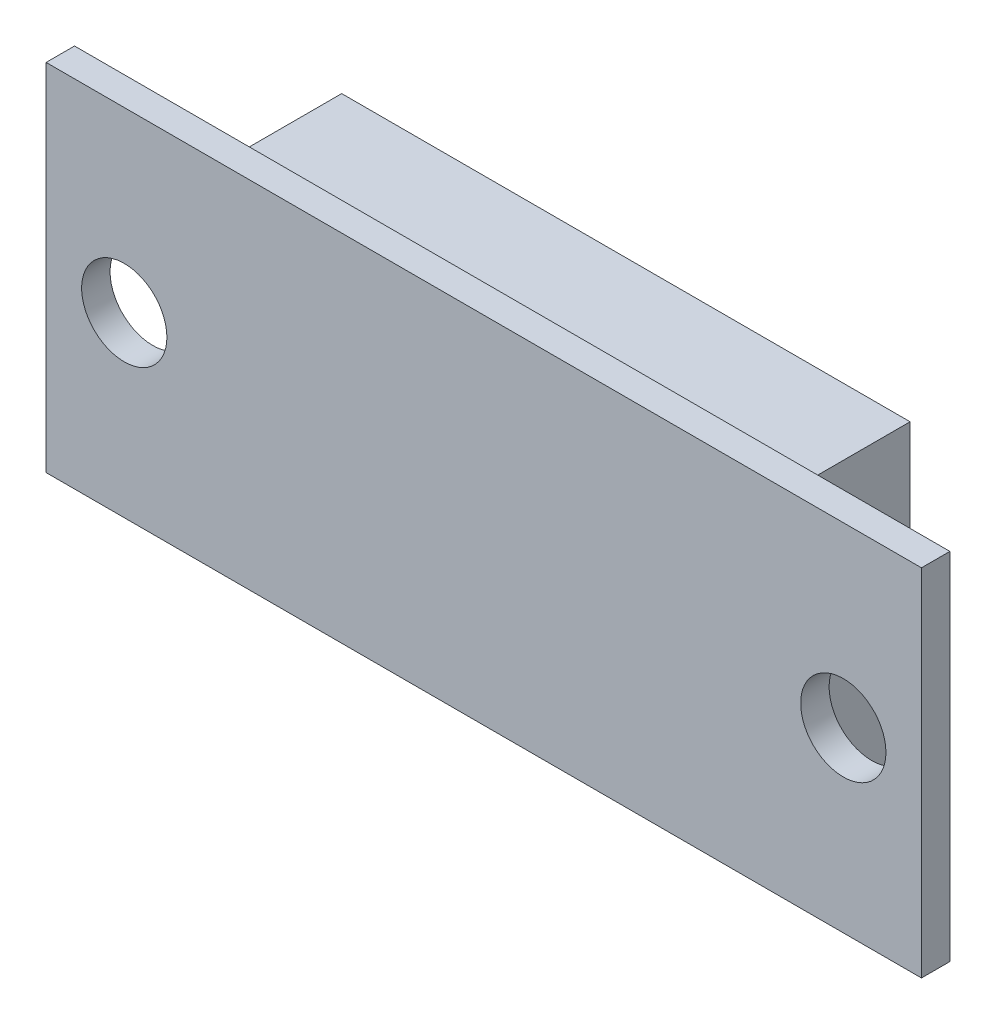
ISO-10303-21;
HEADER;
FILE_DESCRIPTION(('STEP AP214'),'2;1');
FILE_NAME('part.step','',(''),(''),'','','');
FILE_SCHEMA(('AUTOMOTIVE_DESIGN { 1 0 10303 214 1 1 1 1 }'));
ENDSEC;
DATA;
#1=APPLICATION_CONTEXT('core data for automotive mechanical design processes');
#2=APPLICATION_PROTOCOL_DEFINITION('international standard','automotive_design',2000,#1);
#3=PRODUCT_CONTEXT('',#1,'mechanical');
#4=PRODUCT('Part','Part','',(#3));
#5=PRODUCT_RELATED_PRODUCT_CATEGORY('part','',(#4));
#6=PRODUCT_DEFINITION_FORMATION('','',#4);
#7=PRODUCT_DEFINITION_CONTEXT('part definition',#1,'design');
#8=PRODUCT_DEFINITION('design','',#6,#7);
#9=PRODUCT_DEFINITION_SHAPE('','',#8);
#10=(LENGTH_UNIT() NAMED_UNIT(*) SI_UNIT(.MILLI.,.METRE.));
#11=(NAMED_UNIT(*) PLANE_ANGLE_UNIT() SI_UNIT($,.RADIAN.));
#12=(NAMED_UNIT(*) SI_UNIT($,.STERADIAN.) SOLID_ANGLE_UNIT());
#13=UNCERTAINTY_MEASURE_WITH_UNIT(LENGTH_MEASURE(1.E-05),#10,'distance_accuracy_value','');
#14=(GEOMETRIC_REPRESENTATION_CONTEXT(3) GLOBAL_UNCERTAINTY_ASSIGNED_CONTEXT((#13)) GLOBAL_UNIT_ASSIGNED_CONTEXT((#10,
#11,#12)) REPRESENTATION_CONTEXT('',''));
#15=CARTESIAN_POINT('',(0.,0.,0.));
#16=DIRECTION('',(0.,0.,1.));
#17=DIRECTION('',(1.,0.,0.));
#18=AXIS2_PLACEMENT_3D('',#15,#16,#17);
#19=CARTESIAN_POINT('',(15.4,6.25,5.));
#20=DIRECTION('',(0.,0.,-1.));
#21=DIRECTION('',(-1.,0.,0.));
#22=AXIS2_PLACEMENT_3D('',#19,#20,#21);
#23=PLANE('',#22);
#24=DIRECTION('',(0.,1.,0.));
#25=VECTOR('',#24,1.);
#26=CARTESIAN_POINT('',(15.4,-6.25,5.));
#27=LINE('',#26,#25);
#28=CARTESIAN_POINT('',(15.4,-6.25,5.));
#29=VERTEX_POINT('',#28);
#30=CARTESIAN_POINT('',(15.4,6.25,5.));
#31=VERTEX_POINT('',#30);
#32=EDGE_CURVE('E118',#29,#31,#27,.T.);
#33=ORIENTED_EDGE('',*,*,#32,.T.);
#34=DIRECTION('',(-1.,0.,0.));
#35=VECTOR('',#34,1.);
#36=CARTESIAN_POINT('',(-15.4,6.25,5.));
#37=LINE('',#36,#35);
#38=CARTESIAN_POINT('',(-15.4,6.25,5.));
#39=VERTEX_POINT('',#38);
#40=EDGE_CURVE('E107',#31,#39,#37,.T.);
#41=ORIENTED_EDGE('',*,*,#40,.T.);
#42=DIRECTION('',(0.,-1.,0.));
#43=VECTOR('',#42,1.);
#44=CARTESIAN_POINT('',(-15.4,-6.25,5.));
#45=LINE('',#44,#43);
#46=CARTESIAN_POINT('',(-15.4,-6.25,5.));
#47=VERTEX_POINT('',#46);
#48=EDGE_CURVE('E117',#39,#47,#45,.T.);
#49=ORIENTED_EDGE('',*,*,#48,.T.);
#50=DIRECTION('',(1.,0.,0.));
#51=VECTOR('',#50,1.);
#52=CARTESIAN_POINT('',(-15.4,-6.25,5.));
#53=LINE('',#52,#51);
#54=EDGE_CURVE('E123',#47,#29,#53,.T.);
#55=ORIENTED_EDGE('',*,*,#54,.T.);
#56=EDGE_LOOP('',(#33,#41,#49,#55));
#57=FACE_BOUND('',#56,.T.);
#58=CARTESIAN_POINT('',(12.65,0.,5.));
#59=DIRECTION('',(0.,0.,1.));
#60=DIRECTION('',(1.,0.,0.));
#61=AXIS2_PLACEMENT_3D('',#58,#59,#60);
#62=CIRCLE('',#61,1.49999999999999);
#63=CARTESIAN_POINT('',(14.15,0.,5.));
#64=VERTEX_POINT('',#63);
#65=EDGE_CURVE('E199',#64,#64,#62,.T.);
#66=ORIENTED_EDGE('',*,*,#65,.F.);
#67=EDGE_LOOP('',(#66));
#68=FACE_BOUND('',#67,.T.);
#69=CARTESIAN_POINT('',(-12.65,0.,5.));
#70=DIRECTION('',(0.,0.,1.));
#71=DIRECTION('',(1.,0.,0.));
#72=AXIS2_PLACEMENT_3D('',#69,#70,#71);
#73=CIRCLE('',#72,1.49999999999999);
#74=CARTESIAN_POINT('',(-11.15,0.,5.));
#75=VERTEX_POINT('',#74);
#76=EDGE_CURVE('E196',#75,#75,#73,.T.);
#77=ORIENTED_EDGE('',*,*,#76,.F.);
#78=EDGE_LOOP('',(#77));
#79=FACE_BOUND('',#78,.T.);
#80=ADVANCED_FACE('F33',(#57,#68,#79),#23,.F.);
#81=CARTESIAN_POINT('',(10.,5.5,4.));
#82=DIRECTION('',(-1.,0.,0.));
#83=DIRECTION('',(0.,-1.,0.));
#84=AXIS2_PLACEMENT_3D('',#81,#82,#83);
#85=PLANE('',#84);
#86=DIRECTION('',(0.,1.,0.));
#87=VECTOR('',#86,1.);
#88=CARTESIAN_POINT('',(10.,5.5,0.));
#89=LINE('',#88,#87);
#90=CARTESIAN_POINT('',(10.,-5.5,0.));
#91=VERTEX_POINT('',#90);
#92=CARTESIAN_POINT('',(10.,5.5,0.));
#93=VERTEX_POINT('',#92);
#94=EDGE_CURVE('E132',#91,#93,#89,.T.);
#95=ORIENTED_EDGE('',*,*,#94,.T.);
#96=DIRECTION('',(0.,0.,-1.));
#97=VECTOR('',#96,1.);
#98=CARTESIAN_POINT('',(10.,5.5,4.));
#99=LINE('',#98,#97);
#100=CARTESIAN_POINT('',(10.,5.5,4.));
#101=VERTEX_POINT('',#100);
#102=EDGE_CURVE('E11',#101,#93,#99,.T.);
#103=ORIENTED_EDGE('',*,*,#102,.F.);
#104=DIRECTION('',(0.,1.,0.));
#105=VECTOR('',#104,1.);
#106=CARTESIAN_POINT('',(10.,5.5,4.));
#107=LINE('',#106,#105);
#108=CARTESIAN_POINT('',(10.,-5.5,4.));
#109=VERTEX_POINT('',#108);
#110=EDGE_CURVE('E141',#109,#101,#107,.T.);
#111=ORIENTED_EDGE('',*,*,#110,.F.);
#112=DIRECTION('',(0.,0.,-1.));
#113=VECTOR('',#112,1.);
#114=CARTESIAN_POINT('',(10.,-5.5,4.));
#115=LINE('',#114,#113);
#116=EDGE_CURVE('E150',#109,#91,#115,.T.);
#117=ORIENTED_EDGE('',*,*,#116,.T.);
#118=EDGE_LOOP('',(#95,#103,#111,#117));
#119=FACE_BOUND('',#118,.T.);
#120=ADVANCED_FACE('F35',(#119),#85,.F.);
#121=CARTESIAN_POINT('',(-10.,5.5,4.));
#122=DIRECTION('',(0.,-1.,0.));
#123=DIRECTION('',(0.,0.,-1.));
#124=AXIS2_PLACEMENT_3D('',#121,#122,#123);
#125=PLANE('',#124);
#126=DIRECTION('',(-1.,0.,0.));
#127=VECTOR('',#126,1.);
#128=CARTESIAN_POINT('',(-10.,5.5,0.));
#129=LINE('',#128,#127);
#130=CARTESIAN_POINT('',(-10.,5.5,0.));
#131=VERTEX_POINT('',#130);
#132=EDGE_CURVE('E135',#93,#131,#129,.T.);
#133=ORIENTED_EDGE('',*,*,#132,.T.);
#134=DIRECTION('',(0.,0.,-1.));
#135=VECTOR('',#134,1.);
#136=CARTESIAN_POINT('',(-10.,5.5,4.));
#137=LINE('',#136,#135);
#138=CARTESIAN_POINT('',(-10.,5.5,4.));
#139=VERTEX_POINT('',#138);
#140=EDGE_CURVE('E42',#139,#131,#137,.T.);
#141=ORIENTED_EDGE('',*,*,#140,.F.);
#142=DIRECTION('',(-1.,0.,0.));
#143=VECTOR('',#142,1.);
#144=CARTESIAN_POINT('',(-10.,5.5,4.));
#145=LINE('',#144,#143);
#146=EDGE_CURVE('E76',#101,#139,#145,.T.);
#147=ORIENTED_EDGE('',*,*,#146,.F.);
#148=ORIENTED_EDGE('',*,*,#102,.T.);
#149=EDGE_LOOP('',(#133,#141,#147,#148));
#150=FACE_BOUND('',#149,.T.);
#151=ADVANCED_FACE('F181',(#150),#125,.F.);
#152=CARTESIAN_POINT('',(-10.,5.5,4.));
#153=DIRECTION('',(1.,0.,0.));
#154=DIRECTION('',(0.,1.,0.));
#155=AXIS2_PLACEMENT_3D('',#152,#153,#154);
#156=PLANE('',#155);
#157=DIRECTION('',(0.,-1.,0.));
#158=VECTOR('',#157,1.);
#159=CARTESIAN_POINT('',(-10.,5.5,0.));
#160=LINE('',#159,#158);
#161=CARTESIAN_POINT('',(-10.,-5.5,0.));
#162=VERTEX_POINT('',#161);
#163=EDGE_CURVE('E66',#131,#162,#160,.T.);
#164=ORIENTED_EDGE('',*,*,#163,.T.);
#165=DIRECTION('',(0.,0.,-1.));
#166=VECTOR('',#165,1.);
#167=CARTESIAN_POINT('',(-10.,-5.5,4.));
#168=LINE('',#167,#166);
#169=CARTESIAN_POINT('',(-10.,-5.5,4.));
#170=VERTEX_POINT('',#169);
#171=EDGE_CURVE('E50',#170,#162,#168,.T.);
#172=ORIENTED_EDGE('',*,*,#171,.F.);
#173=DIRECTION('',(0.,-1.,0.));
#174=VECTOR('',#173,1.);
#175=CARTESIAN_POINT('',(-10.,5.5,4.));
#176=LINE('',#175,#174);
#177=EDGE_CURVE('E145',#139,#170,#176,.T.);
#178=ORIENTED_EDGE('',*,*,#177,.F.);
#179=ORIENTED_EDGE('',*,*,#140,.T.);
#180=EDGE_LOOP('',(#164,#172,#178,#179));
#181=FACE_BOUND('',#180,.T.);
#182=ADVANCED_FACE('F156',(#181),#156,.F.);
#183=CARTESIAN_POINT('',(-10.,-5.5,4.));
#184=DIRECTION('',(0.,1.,0.));
#185=DIRECTION('',(0.,0.,1.));
#186=AXIS2_PLACEMENT_3D('',#183,#184,#185);
#187=PLANE('',#186);
#188=DIRECTION('',(1.,0.,0.));
#189=VECTOR('',#188,1.);
#190=CARTESIAN_POINT('',(-10.,-5.5,0.));
#191=LINE('',#190,#189);
#192=EDGE_CURVE('E71',#162,#91,#191,.T.);
#193=ORIENTED_EDGE('',*,*,#192,.T.);
#194=ORIENTED_EDGE('',*,*,#116,.F.);
#195=DIRECTION('',(1.,0.,0.));
#196=VECTOR('',#195,1.);
#197=CARTESIAN_POINT('',(-10.,-5.5,4.));
#198=LINE('',#197,#196);
#199=EDGE_CURVE('E148',#170,#109,#198,.T.);
#200=ORIENTED_EDGE('',*,*,#199,.F.);
#201=ORIENTED_EDGE('',*,*,#171,.T.);
#202=EDGE_LOOP('',(#193,#194,#200,#201));
#203=FACE_BOUND('',#202,.T.);
#204=ADVANCED_FACE('F161',(#203),#187,.F.);
#205=CARTESIAN_POINT('',(10.,-5.5,0.));
#206=DIRECTION('',(0.,0.,1.));
#207=DIRECTION('',(1.,0.,0.));
#208=AXIS2_PLACEMENT_3D('',#205,#206,#207);
#209=PLANE('',#208);
#210=ORIENTED_EDGE('',*,*,#94,.F.);
#211=ORIENTED_EDGE('',*,*,#192,.F.);
#212=ORIENTED_EDGE('',*,*,#163,.F.);
#213=ORIENTED_EDGE('',*,*,#132,.F.);
#214=EDGE_LOOP('',(#210,#211,#212,#213));
#215=FACE_BOUND('',#214,.T.);
#216=ADVANCED_FACE('F159',(#215),#209,.F.);
#217=CARTESIAN_POINT('',(15.4,6.25,4.));
#218=DIRECTION('',(0.,0.,-1.));
#219=DIRECTION('',(-1.,0.,0.));
#220=AXIS2_PLACEMENT_3D('',#217,#218,#219);
#221=PLANE('',#220);
#222=CARTESIAN_POINT('',(-12.65,0.,4.));
#223=DIRECTION('',(0.,0.,-1.));
#224=DIRECTION('',(-1.,0.,0.));
#225=AXIS2_PLACEMENT_3D('',#222,#223,#224);
#226=CIRCLE('',#225,1.49999999999999);
#227=CARTESIAN_POINT('',(-14.15,0.,4.));
#228=VERTEX_POINT('',#227);
#229=EDGE_CURVE('E198',#228,#228,#226,.T.);
#230=ORIENTED_EDGE('',*,*,#229,.F.);
#231=EDGE_LOOP('',(#230));
#232=FACE_BOUND('',#231,.T.);
#233=CARTESIAN_POINT('',(12.65,0.,4.));
#234=DIRECTION('',(0.,0.,-1.));
#235=DIRECTION('',(-1.,0.,0.));
#236=AXIS2_PLACEMENT_3D('',#233,#234,#235);
#237=CIRCLE('',#236,1.49999999999999);
#238=CARTESIAN_POINT('',(11.15,0.,4.));
#239=VERTEX_POINT('',#238);
#240=EDGE_CURVE('E202',#239,#239,#237,.T.);
#241=ORIENTED_EDGE('',*,*,#240,.F.);
#242=EDGE_LOOP('',(#241));
#243=FACE_BOUND('',#242,.T.);
#244=DIRECTION('',(0.,1.,0.));
#245=VECTOR('',#244,1.);
#246=CARTESIAN_POINT('',(15.4,-6.25,4.));
#247=LINE('',#246,#245);
#248=CARTESIAN_POINT('',(15.4,-6.25,4.));
#249=VERTEX_POINT('',#248);
#250=CARTESIAN_POINT('',(15.4,6.25,4.));
#251=VERTEX_POINT('',#250);
#252=EDGE_CURVE('E131',#249,#251,#247,.T.);
#253=ORIENTED_EDGE('',*,*,#252,.F.);
#254=DIRECTION('',(1.,0.,0.));
#255=VECTOR('',#254,1.);
#256=CARTESIAN_POINT('',(-15.4,-6.25,4.));
#257=LINE('',#256,#255);
#258=CARTESIAN_POINT('',(-15.4,-6.25,4.));
#259=VERTEX_POINT('',#258);
#260=EDGE_CURVE('E127',#259,#249,#257,.T.);
#261=ORIENTED_EDGE('',*,*,#260,.F.);
#262=DIRECTION('',(0.,-1.,0.));
#263=VECTOR('',#262,1.);
#264=CARTESIAN_POINT('',(-15.4,-6.25,4.));
#265=LINE('',#264,#263);
#266=CARTESIAN_POINT('',(-15.4,6.25,4.));
#267=VERTEX_POINT('',#266);
#268=EDGE_CURVE('E214',#267,#259,#265,.T.);
#269=ORIENTED_EDGE('',*,*,#268,.F.);
#270=DIRECTION('',(-1.,0.,0.));
#271=VECTOR('',#270,1.);
#272=CARTESIAN_POINT('',(-15.4,6.25,4.));
#273=LINE('',#272,#271);
#274=EDGE_CURVE('E212',#251,#267,#273,.T.);
#275=ORIENTED_EDGE('',*,*,#274,.F.);
#276=EDGE_LOOP('',(#253,#261,#269,#275));
#277=FACE_BOUND('',#276,.T.);
#278=ORIENTED_EDGE('',*,*,#110,.T.);
#279=ORIENTED_EDGE('',*,*,#146,.T.);
#280=ORIENTED_EDGE('',*,*,#177,.T.);
#281=ORIENTED_EDGE('',*,*,#199,.T.);
#282=EDGE_LOOP('',(#278,#279,#280,#281));
#283=FACE_BOUND('',#282,.T.);
#284=ADVANCED_FACE('F163',(#232,#243,#277,#283),#221,.T.);
#285=CARTESIAN_POINT('',(15.4,-6.25,5.));
#286=DIRECTION('',(-1.,0.,0.));
#287=DIRECTION('',(0.,0.,1.));
#288=AXIS2_PLACEMENT_3D('',#285,#286,#287);
#289=PLANE('',#288);
#290=ORIENTED_EDGE('',*,*,#252,.T.);
#291=DIRECTION('',(0.,0.,-1.));
#292=VECTOR('',#291,1.);
#293=CARTESIAN_POINT('',(15.4,6.25,5.));
#294=LINE('',#293,#292);
#295=EDGE_CURVE('E111',#31,#251,#294,.T.);
#296=ORIENTED_EDGE('',*,*,#295,.F.);
#297=ORIENTED_EDGE('',*,*,#32,.F.);
#298=DIRECTION('',(0.,0.,-1.));
#299=VECTOR('',#298,1.);
#300=CARTESIAN_POINT('',(15.4,-6.25,5.));
#301=LINE('',#300,#299);
#302=EDGE_CURVE('E210',#29,#249,#301,.T.);
#303=ORIENTED_EDGE('',*,*,#302,.T.);
#304=EDGE_LOOP('',(#290,#296,#297,#303));
#305=FACE_BOUND('',#304,.T.);
#306=ADVANCED_FACE('F129',(#305),#289,.F.);
#307=CARTESIAN_POINT('',(-15.4,6.25,5.));
#308=DIRECTION('',(0.,-1.,0.));
#309=DIRECTION('',(0.,0.,-1.));
#310=AXIS2_PLACEMENT_3D('',#307,#308,#309);
#311=PLANE('',#310);
#312=ORIENTED_EDGE('',*,*,#274,.T.);
#313=DIRECTION('',(0.,0.,-1.));
#314=VECTOR('',#313,1.);
#315=CARTESIAN_POINT('',(-15.4,6.25,5.));
#316=LINE('',#315,#314);
#317=EDGE_CURVE('E114',#39,#267,#316,.T.);
#318=ORIENTED_EDGE('',*,*,#317,.F.);
#319=ORIENTED_EDGE('',*,*,#40,.F.);
#320=ORIENTED_EDGE('',*,*,#295,.T.);
#321=EDGE_LOOP('',(#312,#318,#319,#320));
#322=FACE_BOUND('',#321,.T.);
#323=ADVANCED_FACE('F109',(#322),#311,.F.);
#324=CARTESIAN_POINT('',(-15.4,-6.25,5.));
#325=DIRECTION('',(1.,0.,0.));
#326=DIRECTION('',(0.,0.,-1.));
#327=AXIS2_PLACEMENT_3D('',#324,#325,#326);
#328=PLANE('',#327);
#329=ORIENTED_EDGE('',*,*,#268,.T.);
#330=DIRECTION('',(0.,0.,-1.));
#331=VECTOR('',#330,1.);
#332=CARTESIAN_POINT('',(-15.4,-6.25,5.));
#333=LINE('',#332,#331);
#334=EDGE_CURVE('E137',#47,#259,#333,.T.);
#335=ORIENTED_EDGE('',*,*,#334,.F.);
#336=ORIENTED_EDGE('',*,*,#48,.F.);
#337=ORIENTED_EDGE('',*,*,#317,.T.);
#338=EDGE_LOOP('',(#329,#335,#336,#337));
#339=FACE_BOUND('',#338,.T.);
#340=ADVANCED_FACE('F224',(#339),#328,.F.);
#341=CARTESIAN_POINT('',(-15.4,-6.25,5.));
#342=DIRECTION('',(0.,1.,0.));
#343=DIRECTION('',(0.,0.,1.));
#344=AXIS2_PLACEMENT_3D('',#341,#342,#343);
#345=PLANE('',#344);
#346=ORIENTED_EDGE('',*,*,#260,.T.);
#347=ORIENTED_EDGE('',*,*,#302,.F.);
#348=ORIENTED_EDGE('',*,*,#54,.F.);
#349=ORIENTED_EDGE('',*,*,#334,.T.);
#350=EDGE_LOOP('',(#346,#347,#348,#349));
#351=FACE_BOUND('',#350,.T.);
#352=ADVANCED_FACE('F187',(#351),#345,.F.);
#353=CARTESIAN_POINT('',(12.65,0.,5.));
#354=DIRECTION('',(0.,0.,1.));
#355=DIRECTION('',(1.,0.,0.));
#356=AXIS2_PLACEMENT_3D('',#353,#354,#355);
#357=CYLINDRICAL_SURFACE('',#356,1.49999999999999);
#358=ORIENTED_EDGE('',*,*,#65,.T.);
#359=EDGE_LOOP('',(#358));
#360=FACE_BOUND('',#359,.T.);
#361=ORIENTED_EDGE('',*,*,#240,.T.);
#362=EDGE_LOOP('',(#361));
#363=FACE_BOUND('',#362,.T.);
#364=ADVANCED_FACE('F183',(#360,#363),#357,.F.);
#365=CARTESIAN_POINT('',(-12.65,0.,5.));
#366=DIRECTION('',(0.,0.,1.));
#367=DIRECTION('',(1.,0.,0.));
#368=AXIS2_PLACEMENT_3D('',#365,#366,#367);
#369=CYLINDRICAL_SURFACE('',#368,1.49999999999999);
#370=ORIENTED_EDGE('',*,*,#76,.T.);
#371=EDGE_LOOP('',(#370));
#372=FACE_BOUND('',#371,.T.);
#373=ORIENTED_EDGE('',*,*,#229,.T.);
#374=EDGE_LOOP('',(#373));
#375=FACE_BOUND('',#374,.T.);
#376=ADVANCED_FACE('F186',(#372,#375),#369,.F.);
#377=CLOSED_SHELL('',(#80,#120,#151,#182,#204,#216,#284,#306,#323,#340,#352,#364,#376));
#378=MANIFOLD_SOLID_BREP('B2',#377);
#379=ADVANCED_BREP_SHAPE_REPRESENTATION('',(#18,#378),#14);
#380=SHAPE_DEFINITION_REPRESENTATION(#9,#379);
ENDSEC;
END-ISO-10303-21;
